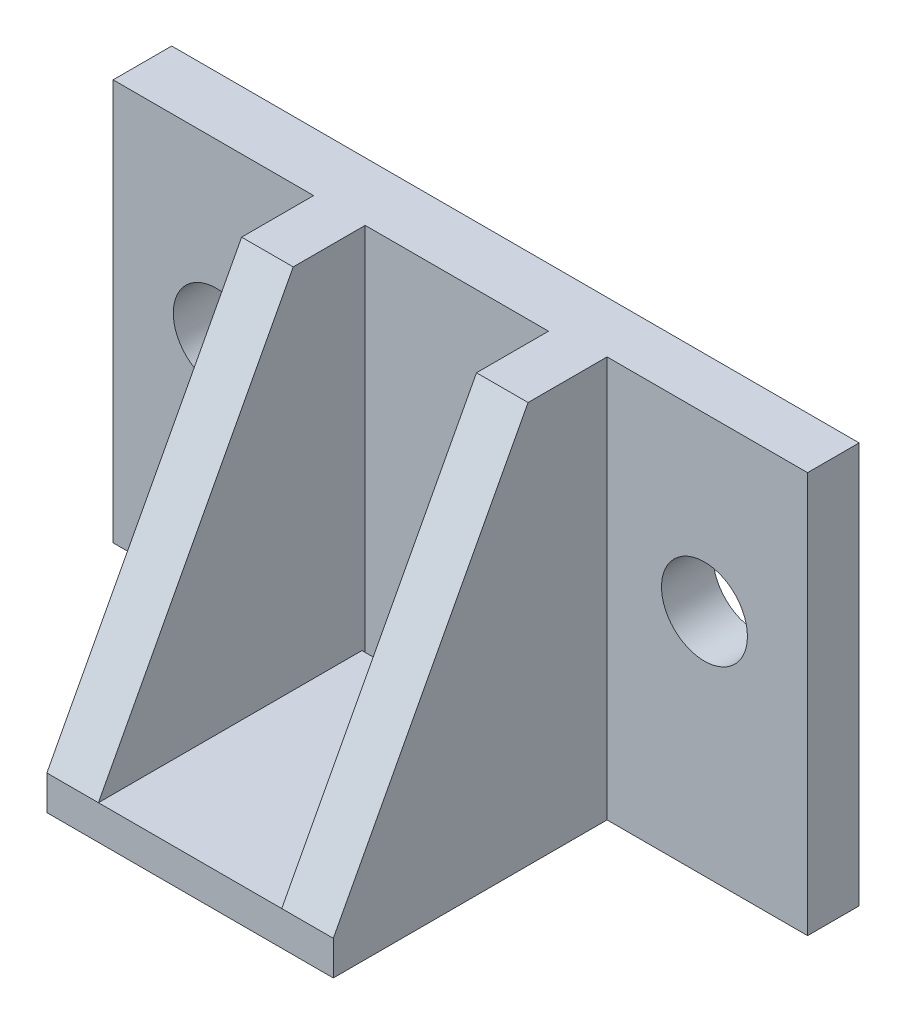
ISO-10303-21;
HEADER;
FILE_DESCRIPTION(('STEP AP214'),'2;1');
FILE_NAME('part.step','',(''),(''),'','','');
FILE_SCHEMA(('AUTOMOTIVE_DESIGN { 1 0 10303 214 1 1 1 1 }'));
ENDSEC;
DATA;
#1=APPLICATION_CONTEXT('core data for automotive mechanical design processes');
#2=APPLICATION_PROTOCOL_DEFINITION('international standard','automotive_design',2000,#1);
#3=PRODUCT_CONTEXT('',#1,'mechanical');
#4=PRODUCT('Part','Part','',(#3));
#5=PRODUCT_RELATED_PRODUCT_CATEGORY('part','',(#4));
#6=PRODUCT_DEFINITION_FORMATION('','',#4);
#7=PRODUCT_DEFINITION_CONTEXT('part definition',#1,'design');
#8=PRODUCT_DEFINITION('design','',#6,#7);
#9=PRODUCT_DEFINITION_SHAPE('','',#8);
#10=(LENGTH_UNIT() NAMED_UNIT(*) SI_UNIT(.MILLI.,.METRE.));
#11=(NAMED_UNIT(*) PLANE_ANGLE_UNIT() SI_UNIT($,.RADIAN.));
#12=(NAMED_UNIT(*) SI_UNIT($,.STERADIAN.) SOLID_ANGLE_UNIT());
#13=UNCERTAINTY_MEASURE_WITH_UNIT(LENGTH_MEASURE(1.E-05),#10,'distance_accuracy_value','');
#14=(GEOMETRIC_REPRESENTATION_CONTEXT(3) GLOBAL_UNCERTAINTY_ASSIGNED_CONTEXT((#13)) GLOBAL_UNIT_ASSIGNED_CONTEXT((#10,
#11,#12)) REPRESENTATION_CONTEXT('',''));
#15=CARTESIAN_POINT('',(0.,0.,0.));
#16=DIRECTION('',(0.,0.,1.));
#17=DIRECTION('',(1.,0.,0.));
#18=AXIS2_PLACEMENT_3D('',#15,#16,#17);
#19=CARTESIAN_POINT('',(35.,70.,10.2258726899384));
#20=DIRECTION('',(0.,0.,1.));
#21=DIRECTION('',(1.,0.,0.));
#22=AXIS2_PLACEMENT_3D('',#19,#20,#21);
#23=PLANE('',#22);
#24=CARTESIAN_POINT('',(18.,40.,10.2258726899384));
#25=DIRECTION('',(0.,0.,1.));
#26=DIRECTION('',(1.,0.,0.));
#27=AXIS2_PLACEMENT_3D('',#24,#25,#26);
#28=CIRCLE('',#27,7.5);
#29=CARTESIAN_POINT('',(25.5,40.,10.2258726899384));
#30=VERTEX_POINT('',#29);
#31=EDGE_CURVE('E294',#30,#30,#28,.T.);
#32=ORIENTED_EDGE('',*,*,#31,.F.);
#33=EDGE_LOOP('',(#32));
#34=FACE_BOUND('',#33,.T.);
#35=DIRECTION('',(-1.,0.,0.));
#36=VECTOR('',#35,1.);
#37=CARTESIAN_POINT('',(35.,0.,10.2258726899384));
#38=LINE('',#37,#36);
#39=CARTESIAN_POINT('',(35.,0.,10.2258726899384));
#40=VERTEX_POINT('',#39);
#41=CARTESIAN_POINT('',(0.,0.,10.2258726899384));
#42=VERTEX_POINT('',#41);
#43=EDGE_CURVE('E219',#40,#42,#38,.T.);
#44=ORIENTED_EDGE('',*,*,#43,.F.);
#45=DIRECTION('',(0.,-1.,0.));
#46=VECTOR('',#45,1.);
#47=CARTESIAN_POINT('',(35.,70.,10.2258726899384));
#48=LINE('',#47,#46);
#49=CARTESIAN_POINT('',(35.,70.,10.2258726899384));
#50=VERTEX_POINT('',#49);
#51=EDGE_CURVE('E11',#50,#40,#48,.T.);
#52=ORIENTED_EDGE('',*,*,#51,.F.);
#53=DIRECTION('',(-1.,0.,0.));
#54=VECTOR('',#53,1.);
#55=CARTESIAN_POINT('',(35.,70.,10.2258726899384));
#56=LINE('',#55,#54);
#57=CARTESIAN_POINT('',(0.,70.,10.2258726899384));
#58=VERTEX_POINT('',#57);
#59=EDGE_CURVE('E179',#50,#58,#56,.T.);
#60=ORIENTED_EDGE('',*,*,#59,.T.);
#61=DIRECTION('',(0.,-1.,0.));
#62=VECTOR('',#61,1.);
#63=CARTESIAN_POINT('',(0.,70.,10.2258726899384));
#64=LINE('',#63,#62);
#65=EDGE_CURVE('E200',#58,#42,#64,.T.);
#66=ORIENTED_EDGE('',*,*,#65,.T.);
#67=EDGE_LOOP('',(#44,#52,#60,#66));
#68=FACE_BOUND('',#67,.T.);
#69=ADVANCED_FACE('F42',(#34,#68),#23,.T.);
#70=CARTESIAN_POINT('',(35.,70.,22.7926078028747));
#71=DIRECTION('',(-1.,0.,0.));
#72=DIRECTION('',(0.,0.,1.));
#73=AXIS2_PLACEMENT_3D('',#70,#71,#72);
#74=PLANE('',#73);
#75=DIRECTION('',(0.,0.,-1.));
#76=VECTOR('',#75,1.);
#77=CARTESIAN_POINT('',(35.,0.,22.7926078028747));
#78=LINE('',#77,#76);
#79=CARTESIAN_POINT('',(35.,0.,56.7926078028747));
#80=VERTEX_POINT('',#79);
#81=EDGE_CURVE('E174',#80,#40,#78,.T.);
#82=ORIENTED_EDGE('',*,*,#81,.F.);
#83=DIRECTION('',(0.,1.,0.));
#84=VECTOR('',#83,1.);
#85=CARTESIAN_POINT('',(35.,0.,56.7926078028747));
#86=LINE('',#85,#84);
#87=CARTESIAN_POINT('',(35.,6.,56.7926078028747));
#88=VERTEX_POINT('',#87);
#89=EDGE_CURVE('E325',#80,#88,#86,.T.);
#90=ORIENTED_EDGE('',*,*,#89,.T.);
#91=DIRECTION('',(0.,0.883115719457411,-0.469155225961749));
#92=VECTOR('',#91,1.);
#93=CARTESIAN_POINT('',(35.,6.,56.7926078028747));
#94=LINE('',#93,#92);
#95=CARTESIAN_POINT('',(35.,70.,22.7926078028747));
#96=VERTEX_POINT('',#95);
#97=EDGE_CURVE('E322',#88,#96,#94,.T.);
#98=ORIENTED_EDGE('',*,*,#97,.T.);
#99=DIRECTION('',(0.,0.,-1.));
#100=VECTOR('',#99,1.);
#101=CARTESIAN_POINT('',(35.,70.,22.7926078028747));
#102=LINE('',#101,#100);
#103=EDGE_CURVE('E202',#96,#50,#102,.T.);
#104=ORIENTED_EDGE('',*,*,#103,.T.);
#105=ORIENTED_EDGE('',*,*,#51,.T.);
#106=EDGE_LOOP('',(#82,#90,#98,#104,#105));
#107=FACE_BOUND('',#106,.T.);
#108=ADVANCED_FACE('F364',(#107),#74,.T.);
#109=CARTESIAN_POINT('',(44.,70.,10.2258726899384));
#110=DIRECTION('',(1.,0.,0.));
#111=DIRECTION('',(0.,0.,-1.));
#112=AXIS2_PLACEMENT_3D('',#109,#110,#111);
#113=PLANE('',#112);
#114=DIRECTION('',(0.,0.,1.));
#115=VECTOR('',#114,1.);
#116=CARTESIAN_POINT('',(44.,6.,10.7926078028747));
#117=LINE('',#116,#115);
#118=CARTESIAN_POINT('',(44.,6.,10.7926078028747));
#119=VERTEX_POINT('',#118);
#120=CARTESIAN_POINT('',(44.,6.,56.7926078028747));
#121=VERTEX_POINT('',#120);
#122=EDGE_CURVE('E166',#119,#121,#117,.T.);
#123=ORIENTED_EDGE('',*,*,#122,.F.);
#124=DIRECTION('',(0.,-1.,0.));
#125=VECTOR('',#124,1.);
#126=CARTESIAN_POINT('',(44.,6.,10.7926078028747));
#127=LINE('',#126,#125);
#128=CARTESIAN_POINT('',(44.,0.,10.7926078028747));
#129=VERTEX_POINT('',#128);
#130=EDGE_CURVE('E152',#119,#129,#127,.T.);
#131=ORIENTED_EDGE('',*,*,#130,.T.);
#132=DIRECTION('',(0.,0.,1.));
#133=VECTOR('',#132,1.);
#134=CARTESIAN_POINT('',(44.,0.,10.2258726899384));
#135=LINE('',#134,#133);
#136=CARTESIAN_POINT('',(44.,0.,10.2258726899384));
#137=VERTEX_POINT('',#136);
#138=EDGE_CURVE('E162',#137,#129,#135,.T.);
#139=ORIENTED_EDGE('',*,*,#138,.F.);
#140=DIRECTION('',(0.,-1.,0.));
#141=VECTOR('',#140,1.);
#142=CARTESIAN_POINT('',(44.,70.,10.2258726899384));
#143=LINE('',#142,#141);
#144=CARTESIAN_POINT('',(44.,70.,10.2258726899384));
#145=VERTEX_POINT('',#144);
#146=EDGE_CURVE('E51',#145,#137,#143,.T.);
#147=ORIENTED_EDGE('',*,*,#146,.F.);
#148=DIRECTION('',(0.,0.,1.));
#149=VECTOR('',#148,1.);
#150=CARTESIAN_POINT('',(44.,70.,10.2258726899384));
#151=LINE('',#150,#149);
#152=CARTESIAN_POINT('',(44.,70.,22.7926078028747));
#153=VERTEX_POINT('',#152);
#154=EDGE_CURVE('E215',#145,#153,#151,.T.);
#155=ORIENTED_EDGE('',*,*,#154,.T.);
#156=DIRECTION('',(0.,0.883115719457411,-0.469155225961749));
#157=VECTOR('',#156,1.);
#158=CARTESIAN_POINT('',(44.,6.,56.7926078028747));
#159=LINE('',#158,#157);
#160=EDGE_CURVE('E321',#121,#153,#159,.T.);
#161=ORIENTED_EDGE('',*,*,#160,.F.);
#162=EDGE_LOOP('',(#123,#131,#139,#147,#155,#161));
#163=FACE_BOUND('',#162,.T.);
#164=ADVANCED_FACE('F161',(#163),#113,.T.);
#165=CARTESIAN_POINT('',(76.,70.,10.2258726899384));
#166=DIRECTION('',(0.,0.,1.));
#167=DIRECTION('',(1.,0.,0.));
#168=AXIS2_PLACEMENT_3D('',#165,#166,#167);
#169=PLANE('',#168);
#170=DIRECTION('',(-1.,0.,0.));
#171=VECTOR('',#170,1.);
#172=CARTESIAN_POINT('',(76.,0.,10.2258726899384));
#173=LINE('',#172,#171);
#174=CARTESIAN_POINT('',(76.,0.,10.2258726899384));
#175=VERTEX_POINT('',#174);
#176=EDGE_CURVE('E172',#175,#137,#173,.T.);
#177=ORIENTED_EDGE('',*,*,#176,.F.);
#178=DIRECTION('',(0.,-1.,0.));
#179=VECTOR('',#178,1.);
#180=CARTESIAN_POINT('',(76.,70.,10.2258726899384));
#181=LINE('',#180,#179);
#182=CARTESIAN_POINT('',(76.,70.,10.2258726899384));
#183=VERTEX_POINT('',#182);
#184=EDGE_CURVE('E186',#183,#175,#181,.T.);
#185=ORIENTED_EDGE('',*,*,#184,.F.);
#186=DIRECTION('',(-1.,0.,0.));
#187=VECTOR('',#186,1.);
#188=CARTESIAN_POINT('',(76.,70.,10.2258726899384));
#189=LINE('',#188,#187);
#190=EDGE_CURVE('E251',#183,#145,#189,.T.);
#191=ORIENTED_EDGE('',*,*,#190,.T.);
#192=ORIENTED_EDGE('',*,*,#146,.T.);
#193=EDGE_LOOP('',(#177,#185,#191,#192));
#194=FACE_BOUND('',#193,.T.);
#195=ADVANCED_FACE('F250',(#194),#169,.T.);
#196=CARTESIAN_POINT('',(76.,70.,22.7926078028747));
#197=DIRECTION('',(-1.,0.,0.));
#198=DIRECTION('',(0.,0.,1.));
#199=AXIS2_PLACEMENT_3D('',#196,#197,#198);
#200=PLANE('',#199);
#201=DIRECTION('',(0.,0.,1.));
#202=VECTOR('',#201,1.);
#203=CARTESIAN_POINT('',(76.,6.,10.7926078028747));
#204=LINE('',#203,#202);
#205=CARTESIAN_POINT('',(76.,6.00000000000001,10.7926078028747));
#206=VERTEX_POINT('',#205);
#207=CARTESIAN_POINT('',(76.,6.,56.7926078028747));
#208=VERTEX_POINT('',#207);
#209=EDGE_CURVE('E331',#206,#208,#204,.T.);
#210=ORIENTED_EDGE('',*,*,#209,.T.);
#211=DIRECTION('',(0.,0.883115719457411,-0.469155225961749));
#212=VECTOR('',#211,1.);
#213=CARTESIAN_POINT('',(76.,6.,56.7926078028747));
#214=LINE('',#213,#212);
#215=CARTESIAN_POINT('',(76.,70.,22.7926078028747));
#216=VERTEX_POINT('',#215);
#217=EDGE_CURVE('E306',#208,#216,#214,.T.);
#218=ORIENTED_EDGE('',*,*,#217,.T.);
#219=DIRECTION('',(0.,0.,-1.));
#220=VECTOR('',#219,1.);
#221=CARTESIAN_POINT('',(76.,70.,22.7926078028747));
#222=LINE('',#221,#220);
#223=EDGE_CURVE('E246',#216,#183,#222,.T.);
#224=ORIENTED_EDGE('',*,*,#223,.T.);
#225=ORIENTED_EDGE('',*,*,#184,.T.);
#226=DIRECTION('',(0.,0.,-1.));
#227=VECTOR('',#226,1.);
#228=CARTESIAN_POINT('',(76.,0.,22.7926078028747));
#229=LINE('',#228,#227);
#230=CARTESIAN_POINT('',(76.,0.,10.7926078028748));
#231=VERTEX_POINT('',#230);
#232=EDGE_CURVE('E64',#231,#175,#229,.T.);
#233=ORIENTED_EDGE('',*,*,#232,.F.);
#234=DIRECTION('',(0.,1.,0.));
#235=VECTOR('',#234,1.);
#236=CARTESIAN_POINT('',(76.,6.,10.7926078028747));
#237=LINE('',#236,#235);
#238=EDGE_CURVE('E59',#231,#206,#237,.T.);
#239=ORIENTED_EDGE('',*,*,#238,.T.);
#240=EDGE_LOOP('',(#210,#218,#224,#225,#233,#239));
#241=FACE_BOUND('',#240,.T.);
#242=ADVANCED_FACE('F244',(#241),#200,.T.);
#243=CARTESIAN_POINT('',(85.,70.,9.00000000000001));
#244=DIRECTION('',(1.,0.,0.));
#245=DIRECTION('',(0.,0.,-1.));
#246=AXIS2_PLACEMENT_3D('',#243,#244,#245);
#247=PLANE('',#246);
#248=DIRECTION('',(0.,0.,1.));
#249=VECTOR('',#248,1.);
#250=CARTESIAN_POINT('',(85.,0.,9.00000000000001));
#251=LINE('',#250,#249);
#252=CARTESIAN_POINT('',(85.,0.,9.00000000000001));
#253=VERTEX_POINT('',#252);
#254=CARTESIAN_POINT('',(85.,0.,56.7926078028747));
#255=VERTEX_POINT('',#254);
#256=EDGE_CURVE('E240',#253,#255,#251,.T.);
#257=ORIENTED_EDGE('',*,*,#256,.F.);
#258=DIRECTION('',(0.,-1.,0.));
#259=VECTOR('',#258,1.);
#260=CARTESIAN_POINT('',(85.,70.,9.00000000000001));
#261=LINE('',#260,#259);
#262=CARTESIAN_POINT('',(85.,70.,9.00000000000001));
#263=VERTEX_POINT('',#262);
#264=EDGE_CURVE('E189',#263,#253,#261,.T.);
#265=ORIENTED_EDGE('',*,*,#264,.F.);
#266=DIRECTION('',(0.,0.,1.));
#267=VECTOR('',#266,1.);
#268=CARTESIAN_POINT('',(85.,70.,9.00000000000001));
#269=LINE('',#268,#267);
#270=CARTESIAN_POINT('',(85.,70.,22.7926078028747));
#271=VERTEX_POINT('',#270);
#272=EDGE_CURVE('E268',#263,#271,#269,.T.);
#273=ORIENTED_EDGE('',*,*,#272,.T.);
#274=DIRECTION('',(0.,0.883115719457411,-0.469155225961749));
#275=VECTOR('',#274,1.);
#276=CARTESIAN_POINT('',(85.,6.,56.7926078028747));
#277=LINE('',#276,#275);
#278=CARTESIAN_POINT('',(85.,6.,56.7926078028747));
#279=VERTEX_POINT('',#278);
#280=EDGE_CURVE('E313',#279,#271,#277,.T.);
#281=ORIENTED_EDGE('',*,*,#280,.F.);
#282=DIRECTION('',(0.,1.,0.));
#283=VECTOR('',#282,1.);
#284=CARTESIAN_POINT('',(85.,0.,56.7926078028747));
#285=LINE('',#284,#283);
#286=EDGE_CURVE('E310',#255,#279,#285,.T.);
#287=ORIENTED_EDGE('',*,*,#286,.F.);
#288=EDGE_LOOP('',(#257,#265,#273,#281,#287));
#289=FACE_BOUND('',#288,.T.);
#290=ADVANCED_FACE('F416',(#289),#247,.T.);
#291=CARTESIAN_POINT('',(120.,70.,9.));
#292=DIRECTION('',(0.,0.,1.));
#293=DIRECTION('',(1.,0.,0.));
#294=AXIS2_PLACEMENT_3D('',#291,#292,#293);
#295=PLANE('',#294);
#296=CARTESIAN_POINT('',(102.,40.,9.00000000000002));
#297=DIRECTION('',(0.,0.,1.));
#298=DIRECTION('',(1.,0.,0.));
#299=AXIS2_PLACEMENT_3D('',#296,#297,#298);
#300=CIRCLE('',#299,7.5);
#301=CARTESIAN_POINT('',(109.5,40.,9.00000000000002));
#302=VERTEX_POINT('',#301);
#303=EDGE_CURVE('E290',#302,#302,#300,.T.);
#304=ORIENTED_EDGE('',*,*,#303,.F.);
#305=EDGE_LOOP('',(#304));
#306=FACE_BOUND('',#305,.T.);
#307=DIRECTION('',(-1.,0.,0.));
#308=VECTOR('',#307,1.);
#309=CARTESIAN_POINT('',(120.,0.,9.));
#310=LINE('',#309,#308);
#311=CARTESIAN_POINT('',(120.,0.,9.));
#312=VERTEX_POINT('',#311);
#313=EDGE_CURVE('E236',#312,#253,#310,.T.);
#314=ORIENTED_EDGE('',*,*,#313,.F.);
#315=DIRECTION('',(0.,-1.,0.));
#316=VECTOR('',#315,1.);
#317=CARTESIAN_POINT('',(120.,70.,9.));
#318=LINE('',#317,#316);
#319=CARTESIAN_POINT('',(120.,70.,9.));
#320=VERTEX_POINT('',#319);
#321=EDGE_CURVE('E192',#320,#312,#318,.T.);
#322=ORIENTED_EDGE('',*,*,#321,.F.);
#323=DIRECTION('',(-1.,0.,0.));
#324=VECTOR('',#323,1.);
#325=CARTESIAN_POINT('',(120.,70.,9.));
#326=LINE('',#325,#324);
#327=EDGE_CURVE('E272',#320,#263,#326,.T.);
#328=ORIENTED_EDGE('',*,*,#327,.T.);
#329=ORIENTED_EDGE('',*,*,#264,.T.);
#330=EDGE_LOOP('',(#314,#322,#328,#329));
#331=FACE_BOUND('',#330,.T.);
#332=ADVANCED_FACE('F419',(#306,#331),#295,.T.);
#333=CARTESIAN_POINT('',(120.,70.,0.));
#334=DIRECTION('',(1.,0.,0.));
#335=DIRECTION('',(0.,0.,-1.));
#336=AXIS2_PLACEMENT_3D('',#333,#334,#335);
#337=PLANE('',#336);
#338=DIRECTION('',(0.,0.,1.));
#339=VECTOR('',#338,1.);
#340=CARTESIAN_POINT('',(120.,0.,0.));
#341=LINE('',#340,#339);
#342=CARTESIAN_POINT('',(120.,0.,0.));
#343=VERTEX_POINT('',#342);
#344=EDGE_CURVE('E232',#343,#312,#341,.T.);
#345=ORIENTED_EDGE('',*,*,#344,.F.);
#346=DIRECTION('',(0.,-1.,0.));
#347=VECTOR('',#346,1.);
#348=CARTESIAN_POINT('',(120.,70.,0.));
#349=LINE('',#348,#347);
#350=CARTESIAN_POINT('',(120.,70.,0.));
#351=VERTEX_POINT('',#350);
#352=EDGE_CURVE('E195',#351,#343,#349,.T.);
#353=ORIENTED_EDGE('',*,*,#352,.F.);
#354=DIRECTION('',(0.,0.,1.));
#355=VECTOR('',#354,1.);
#356=CARTESIAN_POINT('',(120.,70.,0.));
#357=LINE('',#356,#355);
#358=EDGE_CURVE('E276',#351,#320,#357,.T.);
#359=ORIENTED_EDGE('',*,*,#358,.T.);
#360=ORIENTED_EDGE('',*,*,#321,.T.);
#361=EDGE_LOOP('',(#345,#353,#359,#360));
#362=FACE_BOUND('',#361,.T.);
#363=ADVANCED_FACE('F352',(#362),#337,.T.);
#364=CARTESIAN_POINT('',(0.,70.,0.));
#365=DIRECTION('',(0.,0.,-1.));
#366=DIRECTION('',(-1.,0.,0.));
#367=AXIS2_PLACEMENT_3D('',#364,#365,#366);
#368=PLANE('',#367);
#369=CARTESIAN_POINT('',(18.,40.,0.));
#370=DIRECTION('',(0.,0.,-1.));
#371=DIRECTION('',(-1.,0.,0.));
#372=AXIS2_PLACEMENT_3D('',#369,#370,#371);
#373=CIRCLE('',#372,7.5);
#374=CARTESIAN_POINT('',(10.5,40.,0.));
#375=VERTEX_POINT('',#374);
#376=EDGE_CURVE('E45',#375,#375,#373,.T.);
#377=ORIENTED_EDGE('',*,*,#376,.F.);
#378=EDGE_LOOP('',(#377));
#379=FACE_BOUND('',#378,.T.);
#380=CARTESIAN_POINT('',(102.,40.,0.));
#381=DIRECTION('',(0.,0.,1.));
#382=DIRECTION('',(1.,0.,0.));
#383=AXIS2_PLACEMENT_3D('',#380,#381,#382);
#384=CIRCLE('',#383,7.5);
#385=CARTESIAN_POINT('',(109.5,40.,0.));
#386=VERTEX_POINT('',#385);
#387=EDGE_CURVE('E224',#386,#386,#384,.T.);
#388=ORIENTED_EDGE('',*,*,#387,.T.);
#389=EDGE_LOOP('',(#388));
#390=FACE_BOUND('',#389,.T.);
#391=DIRECTION('',(1.,0.,0.));
#392=VECTOR('',#391,1.);
#393=CARTESIAN_POINT('',(0.,0.,0.));
#394=LINE('',#393,#392);
#395=CARTESIAN_POINT('',(0.,0.,0.));
#396=VERTEX_POINT('',#395);
#397=EDGE_CURVE('E228',#396,#343,#394,.T.);
#398=ORIENTED_EDGE('',*,*,#397,.F.);
#399=DIRECTION('',(0.,-1.,0.));
#400=VECTOR('',#399,1.);
#401=CARTESIAN_POINT('',(0.,70.,0.));
#402=LINE('',#401,#400);
#403=CARTESIAN_POINT('',(0.,70.,0.));
#404=VERTEX_POINT('',#403);
#405=EDGE_CURVE('E198',#404,#396,#402,.T.);
#406=ORIENTED_EDGE('',*,*,#405,.F.);
#407=DIRECTION('',(1.,0.,0.));
#408=VECTOR('',#407,1.);
#409=CARTESIAN_POINT('',(0.,70.,0.));
#410=LINE('',#409,#408);
#411=EDGE_CURVE('E280',#404,#351,#410,.T.);
#412=ORIENTED_EDGE('',*,*,#411,.T.);
#413=ORIENTED_EDGE('',*,*,#352,.T.);
#414=EDGE_LOOP('',(#398,#406,#412,#413));
#415=FACE_BOUND('',#414,.T.);
#416=ADVANCED_FACE('F348',(#379,#390,#415),#368,.T.);
#417=CARTESIAN_POINT('',(0.,70.,10.2258726899384));
#418=DIRECTION('',(-1.,0.,0.));
#419=DIRECTION('',(0.,0.,1.));
#420=AXIS2_PLACEMENT_3D('',#417,#418,#419);
#421=PLANE('',#420);
#422=DIRECTION('',(0.,0.,-1.));
#423=VECTOR('',#422,1.);
#424=CARTESIAN_POINT('',(0.,0.,10.2258726899384));
#425=LINE('',#424,#423);
#426=EDGE_CURVE('E223',#42,#396,#425,.T.);
#427=ORIENTED_EDGE('',*,*,#426,.F.);
#428=ORIENTED_EDGE('',*,*,#65,.F.);
#429=DIRECTION('',(0.,0.,-1.));
#430=VECTOR('',#429,1.);
#431=CARTESIAN_POINT('',(0.,70.,10.2258726899384));
#432=LINE('',#431,#430);
#433=EDGE_CURVE('E284',#58,#404,#432,.T.);
#434=ORIENTED_EDGE('',*,*,#433,.T.);
#435=ORIENTED_EDGE('',*,*,#405,.T.);
#436=EDGE_LOOP('',(#427,#428,#434,#435));
#437=FACE_BOUND('',#436,.T.);
#438=ADVANCED_FACE('F351',(#437),#421,.T.);
#439=CARTESIAN_POINT('',(0.,70.,0.));
#440=DIRECTION('',(0.,-1.,0.));
#441=DIRECTION('',(0.,0.,-1.));
#442=AXIS2_PLACEMENT_3D('',#439,#440,#441);
#443=PLANE('',#442);
#444=ORIENTED_EDGE('',*,*,#59,.F.);
#445=ORIENTED_EDGE('',*,*,#103,.F.);
#446=DIRECTION('',(-1.,0.,0.));
#447=VECTOR('',#446,1.);
#448=CARTESIAN_POINT('',(44.,70.,22.7926078028747));
#449=LINE('',#448,#447);
#450=EDGE_CURVE('E209',#153,#96,#449,.T.);
#451=ORIENTED_EDGE('',*,*,#450,.F.);
#452=ORIENTED_EDGE('',*,*,#154,.F.);
#453=ORIENTED_EDGE('',*,*,#190,.F.);
#454=ORIENTED_EDGE('',*,*,#223,.F.);
#455=DIRECTION('',(-1.,0.,0.));
#456=VECTOR('',#455,1.);
#457=CARTESIAN_POINT('',(85.,70.,22.7926078028747));
#458=LINE('',#457,#456);
#459=EDGE_CURVE('E264',#271,#216,#458,.T.);
#460=ORIENTED_EDGE('',*,*,#459,.F.);
#461=ORIENTED_EDGE('',*,*,#272,.F.);
#462=ORIENTED_EDGE('',*,*,#327,.F.);
#463=ORIENTED_EDGE('',*,*,#358,.F.);
#464=ORIENTED_EDGE('',*,*,#411,.F.);
#465=ORIENTED_EDGE('',*,*,#433,.F.);
#466=EDGE_LOOP('',(#444,#445,#451,#452,#453,#454,#460,#461,#462,#463,#464,#465));
#467=FACE_BOUND('',#466,.T.);
#468=ADVANCED_FACE('F257',(#467),#443,.F.);
#469=CARTESIAN_POINT('',(0.,0.,0.));
#470=DIRECTION('',(0.,-1.,0.));
#471=DIRECTION('',(0.,0.,-1.));
#472=AXIS2_PLACEMENT_3D('',#469,#470,#471);
#473=PLANE('',#472);
#474=DIRECTION('',(1.,0.,0.));
#475=VECTOR('',#474,1.);
#476=CARTESIAN_POINT('',(76.,0.,56.7926078028747));
#477=LINE('',#476,#475);
#478=EDGE_CURVE('E301',#80,#255,#477,.T.);
#479=ORIENTED_EDGE('',*,*,#478,.F.);
#480=ORIENTED_EDGE('',*,*,#81,.T.);
#481=ORIENTED_EDGE('',*,*,#43,.T.);
#482=ORIENTED_EDGE('',*,*,#426,.T.);
#483=ORIENTED_EDGE('',*,*,#397,.T.);
#484=ORIENTED_EDGE('',*,*,#344,.T.);
#485=ORIENTED_EDGE('',*,*,#313,.T.);
#486=ORIENTED_EDGE('',*,*,#256,.T.);
#487=EDGE_LOOP('',(#479,#480,#481,#482,#483,#484,#485,#486));
#488=FACE_BOUND('',#487,.T.);
#489=ORIENTED_EDGE('',*,*,#138,.T.);
#490=DIRECTION('',(1.,0.,0.));
#491=VECTOR('',#490,1.);
#492=CARTESIAN_POINT('',(44.,0.,10.7926078028747));
#493=LINE('',#492,#491);
#494=EDGE_CURVE('E148',#129,#231,#493,.T.);
#495=ORIENTED_EDGE('',*,*,#494,.T.);
#496=ORIENTED_EDGE('',*,*,#232,.T.);
#497=ORIENTED_EDGE('',*,*,#176,.T.);
#498=EDGE_LOOP('',(#489,#495,#496,#497));
#499=FACE_BOUND('',#498,.T.);
#500=ADVANCED_FACE('F170',(#488,#499),#473,.T.);
#501=CARTESIAN_POINT('',(102.,40.,0.));
#502=DIRECTION('',(0.,0.,1.));
#503=DIRECTION('',(1.,0.,0.));
#504=AXIS2_PLACEMENT_3D('',#501,#502,#503);
#505=CYLINDRICAL_SURFACE('',#504,7.5);
#506=ORIENTED_EDGE('',*,*,#387,.F.);
#507=EDGE_LOOP('',(#506));
#508=FACE_BOUND('',#507,.T.);
#509=ORIENTED_EDGE('',*,*,#303,.T.);
#510=EDGE_LOOP('',(#509));
#511=FACE_BOUND('',#510,.T.);
#512=ADVANCED_FACE('F397',(#508,#511),#505,.F.);
#513=CARTESIAN_POINT('',(18.,40.,1.2258726899384));
#514=DIRECTION('',(0.,0.,1.));
#515=DIRECTION('',(1.,0.,0.));
#516=AXIS2_PLACEMENT_3D('',#513,#514,#515);
#517=CYLINDRICAL_SURFACE('',#516,7.5);
#518=ORIENTED_EDGE('',*,*,#31,.T.);
#519=EDGE_LOOP('',(#518));
#520=FACE_BOUND('',#519,.T.);
#521=ORIENTED_EDGE('',*,*,#376,.T.);
#522=EDGE_LOOP('',(#521));
#523=FACE_BOUND('',#522,.T.);
#524=ADVANCED_FACE('F346',(#520,#523),#517,.F.);
#525=CARTESIAN_POINT('',(76.,0.,56.7926078028747));
#526=DIRECTION('',(0.,0.,-1.));
#527=DIRECTION('',(-1.,0.,0.));
#528=AXIS2_PLACEMENT_3D('',#525,#526,#527);
#529=PLANE('',#528);
#530=ORIENTED_EDGE('',*,*,#286,.T.);
#531=DIRECTION('',(1.,0.,0.));
#532=VECTOR('',#531,1.);
#533=CARTESIAN_POINT('',(76.,6.,56.7926078028747));
#534=LINE('',#533,#532);
#535=EDGE_CURVE('E302',#208,#279,#534,.T.);
#536=ORIENTED_EDGE('',*,*,#535,.F.);
#537=DIRECTION('',(-1.,0.,0.));
#538=VECTOR('',#537,1.);
#539=CARTESIAN_POINT('',(44.,6.,56.7926078028747));
#540=LINE('',#539,#538);
#541=EDGE_CURVE('E168',#208,#121,#540,.T.);
#542=ORIENTED_EDGE('',*,*,#541,.T.);
#543=DIRECTION('',(-1.,0.,0.));
#544=VECTOR('',#543,1.);
#545=CARTESIAN_POINT('',(44.,6.,56.7926078028747));
#546=LINE('',#545,#544);
#547=EDGE_CURVE('E316',#121,#88,#546,.T.);
#548=ORIENTED_EDGE('',*,*,#547,.T.);
#549=ORIENTED_EDGE('',*,*,#89,.F.);
#550=ORIENTED_EDGE('',*,*,#478,.T.);
#551=EDGE_LOOP('',(#530,#536,#542,#548,#549,#550));
#552=FACE_BOUND('',#551,.T.);
#553=ADVANCED_FACE('F368',(#552),#529,.F.);
#554=CARTESIAN_POINT('',(76.,6.,56.7926078028747));
#555=DIRECTION('',(0.,-0.469155225961749,-0.883115719457411));
#556=DIRECTION('',(0.,0.883115719457411,-0.469155225961749));
#557=AXIS2_PLACEMENT_3D('',#554,#555,#556);
#558=PLANE('',#557);
#559=ORIENTED_EDGE('',*,*,#280,.T.);
#560=ORIENTED_EDGE('',*,*,#459,.T.);
#561=ORIENTED_EDGE('',*,*,#217,.F.);
#562=ORIENTED_EDGE('',*,*,#535,.T.);
#563=EDGE_LOOP('',(#559,#560,#561,#562));
#564=FACE_BOUND('',#563,.T.);
#565=ADVANCED_FACE('F377',(#564),#558,.F.);
#566=CARTESIAN_POINT('',(44.,6.,56.7926078028747));
#567=DIRECTION('',(0.,0.469155225961749,0.883115719457411));
#568=DIRECTION('',(0.,-0.883115719457411,0.469155225961749));
#569=AXIS2_PLACEMENT_3D('',#566,#567,#568);
#570=PLANE('',#569);
#571=ORIENTED_EDGE('',*,*,#97,.F.);
#572=ORIENTED_EDGE('',*,*,#547,.F.);
#573=ORIENTED_EDGE('',*,*,#160,.T.);
#574=ORIENTED_EDGE('',*,*,#450,.T.);
#575=EDGE_LOOP('',(#571,#572,#573,#574));
#576=FACE_BOUND('',#575,.T.);
#577=ADVANCED_FACE('F374',(#576),#570,.T.);
#578=CARTESIAN_POINT('',(44.,6.,10.7926078028747));
#579=DIRECTION('',(0.,1.,0.));
#580=DIRECTION('',(0.,0.,1.));
#581=AXIS2_PLACEMENT_3D('',#578,#579,#580);
#582=PLANE('',#581);
#583=ORIENTED_EDGE('',*,*,#541,.F.);
#584=ORIENTED_EDGE('',*,*,#209,.F.);
#585=DIRECTION('',(-1.,0.,0.));
#586=VECTOR('',#585,1.);
#587=CARTESIAN_POINT('',(44.,6.,10.7926078028747));
#588=LINE('',#587,#586);
#589=EDGE_CURVE('E334',#206,#119,#588,.T.);
#590=ORIENTED_EDGE('',*,*,#589,.T.);
#591=ORIENTED_EDGE('',*,*,#122,.T.);
#592=EDGE_LOOP('',(#583,#584,#590,#591));
#593=FACE_BOUND('',#592,.T.);
#594=ADVANCED_FACE('F376',(#593),#582,.T.);
#595=CARTESIAN_POINT('',(0.,0.,10.7926078028747));
#596=DIRECTION('',(0.,0.,1.));
#597=DIRECTION('',(1.,0.,0.));
#598=AXIS2_PLACEMENT_3D('',#595,#596,#597);
#599=PLANE('',#598);
#600=ORIENTED_EDGE('',*,*,#130,.F.);
#601=ORIENTED_EDGE('',*,*,#589,.F.);
#602=ORIENTED_EDGE('',*,*,#238,.F.);
#603=ORIENTED_EDGE('',*,*,#494,.F.);
#604=EDGE_LOOP('',(#600,#601,#602,#603));
#605=FACE_BOUND('',#604,.T.);
#606=ADVANCED_FACE('F150',(#605),#599,.F.);
#607=CLOSED_SHELL('',(#69,#108,#164,#195,#242,#290,#332,#363,#416,#438,#468,#500,#512,#524,#553,
#565,#577,#594,#606));
#608=MANIFOLD_SOLID_BREP('B2',#607);
#609=ADVANCED_BREP_SHAPE_REPRESENTATION('',(#18,#608),#14);
#610=SHAPE_DEFINITION_REPRESENTATION(#9,#609);
ENDSEC;
END-ISO-10303-21;
